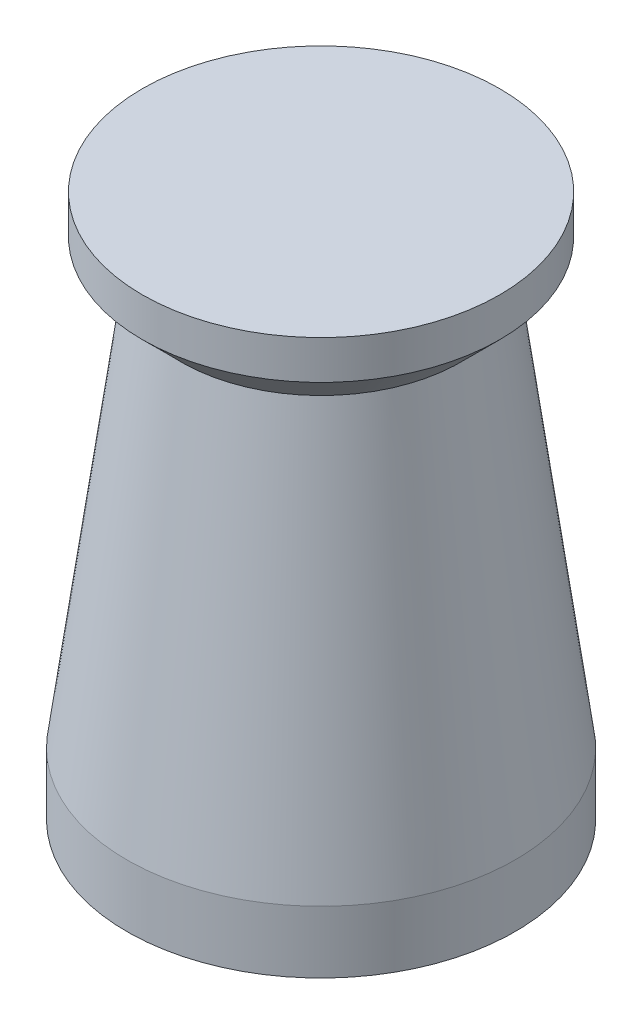
ISO-10303-21;
HEADER;
FILE_DESCRIPTION(('STEP AP214'),'2;1');
FILE_NAME('part.step','',(''),(''),'','','');
FILE_SCHEMA(('AUTOMOTIVE_DESIGN { 1 0 10303 214 1 1 1 1 }'));
ENDSEC;
DATA;
#1=APPLICATION_CONTEXT('core data for automotive mechanical design processes');
#2=APPLICATION_PROTOCOL_DEFINITION('international standard','automotive_design',2000,#1);
#3=PRODUCT_CONTEXT('',#1,'mechanical');
#4=PRODUCT('Part','Part','',(#3));
#5=PRODUCT_RELATED_PRODUCT_CATEGORY('part','',(#4));
#6=PRODUCT_DEFINITION_FORMATION('','',#4);
#7=PRODUCT_DEFINITION_CONTEXT('part definition',#1,'design');
#8=PRODUCT_DEFINITION('design','',#6,#7);
#9=PRODUCT_DEFINITION_SHAPE('','',#8);
#10=(LENGTH_UNIT() NAMED_UNIT(*) SI_UNIT(.MILLI.,.METRE.));
#11=(NAMED_UNIT(*) PLANE_ANGLE_UNIT() SI_UNIT($,.RADIAN.));
#12=(NAMED_UNIT(*) SI_UNIT($,.STERADIAN.) SOLID_ANGLE_UNIT());
#13=UNCERTAINTY_MEASURE_WITH_UNIT(LENGTH_MEASURE(1.E-05),#10,'distance_accuracy_value','');
#14=(GEOMETRIC_REPRESENTATION_CONTEXT(3) GLOBAL_UNCERTAINTY_ASSIGNED_CONTEXT((#13)) GLOBAL_UNIT_ASSIGNED_CONTEXT((#10,
#11,#12)) REPRESENTATION_CONTEXT('',''));
#15=CARTESIAN_POINT('',(0.,0.,0.));
#16=DIRECTION('',(0.,0.,1.));
#17=DIRECTION('',(1.,0.,0.));
#18=AXIS2_PLACEMENT_3D('',#15,#16,#17);
#19=CARTESIAN_POINT('',(0.,0.,0.));
#20=DIRECTION('',(0.,1.,0.));
#21=DIRECTION('',(-1.,0.,0.));
#22=AXIS2_PLACEMENT_3D('',#19,#20,#21);
#23=PLANE('',#22);
#24=CARTESIAN_POINT('',(0.,0.,0.));
#25=DIRECTION('',(0.,1.,0.));
#26=DIRECTION('',(-1.,0.,0.));
#27=AXIS2_PLACEMENT_3D('',#24,#25,#26);
#28=CIRCLE('',#27,25.);
#29=CARTESIAN_POINT('',(-25.,0.,0.));
#30=VERTEX_POINT('',#29);
#31=EDGE_CURVE('E10',#30,#30,#28,.T.);
#32=ORIENTED_EDGE('',*,*,#31,.F.);
#33=EDGE_LOOP('',(#32));
#34=FACE_BOUND('',#33,.T.);
#35=ADVANCED_FACE('F34',(#34),#23,.F.);
#36=CARTESIAN_POINT('',(0.,70.,0.));
#37=DIRECTION('',(0.,1.,0.));
#38=DIRECTION('',(-1.,0.,0.));
#39=AXIS2_PLACEMENT_3D('',#36,#37,#38);
#40=CYLINDRICAL_SURFACE('',#39,25.);
#41=CARTESIAN_POINT('',(0.,8.,0.));
#42=DIRECTION('',(0.,1.,0.));
#43=DIRECTION('',(-1.,0.,0.));
#44=AXIS2_PLACEMENT_3D('',#41,#42,#43);
#45=CIRCLE('',#44,25.);
#46=CARTESIAN_POINT('',(-25.,8.,0.));
#47=VERTEX_POINT('',#46);
#48=EDGE_CURVE('E40',#47,#47,#45,.T.);
#49=ORIENTED_EDGE('',*,*,#48,.F.);
#50=EDGE_LOOP('',(#49));
#51=FACE_BOUND('',#50,.T.);
#52=ORIENTED_EDGE('',*,*,#31,.T.);
#53=EDGE_LOOP('',(#52));
#54=FACE_BOUND('',#53,.T.);
#55=ADVANCED_FACE('F73',(#51,#54),#40,.T.);
#56=CARTESIAN_POINT('',(0.,8.,0.));
#57=DIRECTION('',(0.,-1.,0.));
#58=DIRECTION('',(1.,0.,0.));
#59=AXIS2_PLACEMENT_3D('',#56,#57,#58);
#60=CONICAL_SURFACE('',#59,25.,0.133810977474591);
#61=CARTESIAN_POINT('',(0.,60.,0.));
#62=DIRECTION('',(0.,1.,0.));
#63=DIRECTION('',(-1.,0.,0.));
#64=AXIS2_PLACEMENT_3D('',#61,#62,#63);
#65=CIRCLE('',#64,18.);
#66=CARTESIAN_POINT('',(-18.,60.,0.));
#67=VERTEX_POINT('',#66);
#68=EDGE_CURVE('E44',#67,#67,#65,.T.);
#69=ORIENTED_EDGE('',*,*,#68,.F.);
#70=EDGE_LOOP('',(#69));
#71=FACE_BOUND('',#70,.T.);
#72=ORIENTED_EDGE('',*,*,#48,.T.);
#73=EDGE_LOOP('',(#72));
#74=FACE_BOUND('',#73,.T.);
#75=ADVANCED_FACE('F68',(#71,#74),#60,.T.);
#76=CARTESIAN_POINT('',(0.,60.,0.));
#77=DIRECTION('',(0.,1.,0.));
#78=DIRECTION('',(-1.,0.,0.));
#79=AXIS2_PLACEMENT_3D('',#76,#77,#78);
#80=CONICAL_SURFACE('',#79,18.,0.785398163397448);
#81=CARTESIAN_POINT('',(0.,65.,0.));
#82=DIRECTION('',(0.,1.,0.));
#83=DIRECTION('',(-1.,0.,0.));
#84=AXIS2_PLACEMENT_3D('',#81,#82,#83);
#85=CIRCLE('',#84,23.);
#86=CARTESIAN_POINT('',(-23.,65.,0.));
#87=VERTEX_POINT('',#86);
#88=EDGE_CURVE('E48',#87,#87,#85,.T.);
#89=ORIENTED_EDGE('',*,*,#88,.F.);
#90=EDGE_LOOP('',(#89));
#91=FACE_BOUND('',#90,.T.);
#92=ORIENTED_EDGE('',*,*,#68,.T.);
#93=EDGE_LOOP('',(#92));
#94=FACE_BOUND('',#93,.T.);
#95=ADVANCED_FACE('F62',(#91,#94),#80,.T.);
#96=CARTESIAN_POINT('',(0.,70.,0.));
#97=DIRECTION('',(0.,1.,0.));
#98=DIRECTION('',(-1.,0.,0.));
#99=AXIS2_PLACEMENT_3D('',#96,#97,#98);
#100=CYLINDRICAL_SURFACE('',#99,23.);
#101=CARTESIAN_POINT('',(0.,70.,0.));
#102=DIRECTION('',(0.,1.,0.));
#103=DIRECTION('',(-1.,0.,0.));
#104=AXIS2_PLACEMENT_3D('',#101,#102,#103);
#105=CIRCLE('',#104,23.);
#106=CARTESIAN_POINT('',(-23.,70.,0.));
#107=VERTEX_POINT('',#106);
#108=EDGE_CURVE('E53',#107,#107,#105,.T.);
#109=ORIENTED_EDGE('',*,*,#108,.F.);
#110=EDGE_LOOP('',(#109));
#111=FACE_BOUND('',#110,.T.);
#112=ORIENTED_EDGE('',*,*,#88,.T.);
#113=EDGE_LOOP('',(#112));
#114=FACE_BOUND('',#113,.T.);
#115=ADVANCED_FACE('F59',(#111,#114),#100,.T.);
#116=CARTESIAN_POINT('',(23.,70.,0.));
#117=DIRECTION('',(0.,-1.,0.));
#118=DIRECTION('',(1.,0.,0.));
#119=AXIS2_PLACEMENT_3D('',#116,#117,#118);
#120=PLANE('',#119);
#121=ORIENTED_EDGE('',*,*,#108,.T.);
#122=EDGE_LOOP('',(#121));
#123=FACE_BOUND('',#122,.T.);
#124=ADVANCED_FACE('F57',(#123),#120,.F.);
#125=CLOSED_SHELL('',(#35,#55,#75,#95,#115,#124));
#126=MANIFOLD_SOLID_BREP('B2',#125);
#127=ADVANCED_BREP_SHAPE_REPRESENTATION('',(#18,#126),#14);
#128=SHAPE_DEFINITION_REPRESENTATION(#9,#127);
ENDSEC;
END-ISO-10303-21;
